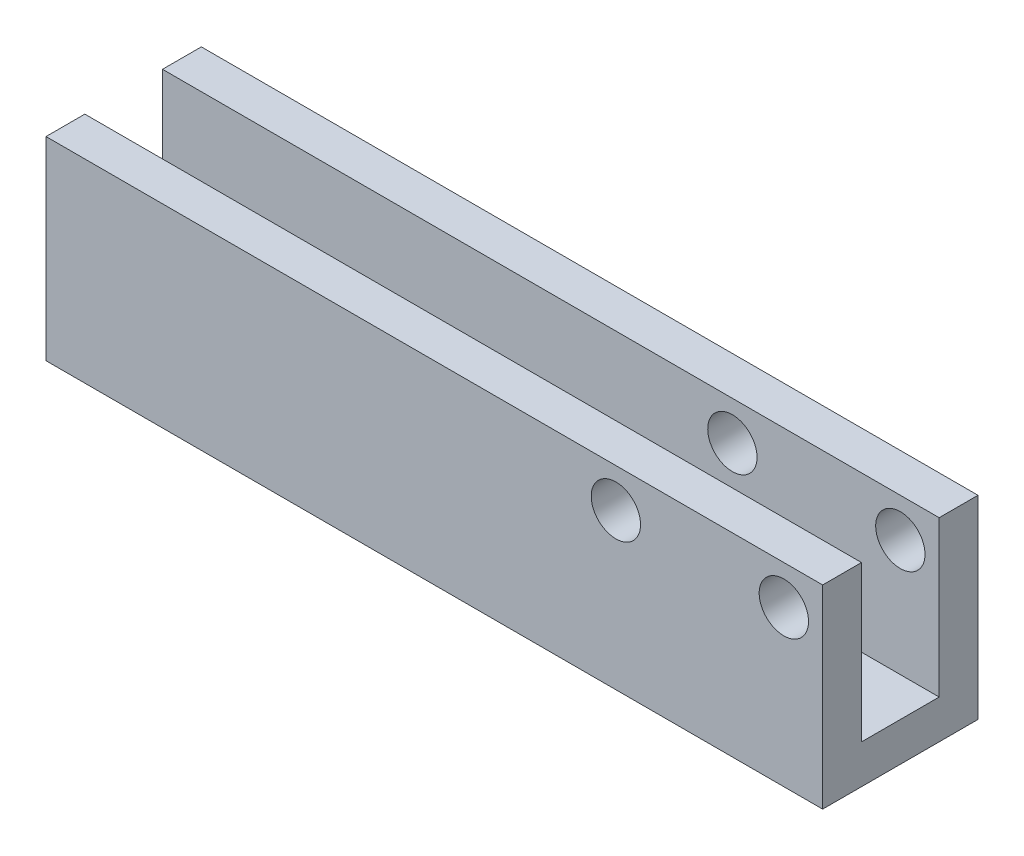
ISO-10303-21;
HEADER;
FILE_DESCRIPTION(('STEP AP214'),'2;1');
FILE_NAME('part.step','',(''),(''),'','','');
FILE_SCHEMA(('AUTOMOTIVE_DESIGN { 1 0 10303 214 1 1 1 1 }'));
ENDSEC;
DATA;
#1=APPLICATION_CONTEXT('core data for automotive mechanical design processes');
#2=APPLICATION_PROTOCOL_DEFINITION('international standard','automotive_design',2000,#1);
#3=PRODUCT_CONTEXT('',#1,'mechanical');
#4=PRODUCT('Part','Part','',(#3));
#5=PRODUCT_RELATED_PRODUCT_CATEGORY('part','',(#4));
#6=PRODUCT_DEFINITION_FORMATION('','',#4);
#7=PRODUCT_DEFINITION_CONTEXT('part definition',#1,'design');
#8=PRODUCT_DEFINITION('design','',#6,#7);
#9=PRODUCT_DEFINITION_SHAPE('','',#8);
#10=(LENGTH_UNIT() NAMED_UNIT(*) SI_UNIT(.MILLI.,.METRE.));
#11=(NAMED_UNIT(*) PLANE_ANGLE_UNIT() SI_UNIT($,.RADIAN.));
#12=(NAMED_UNIT(*) SI_UNIT($,.STERADIAN.) SOLID_ANGLE_UNIT());
#13=UNCERTAINTY_MEASURE_WITH_UNIT(LENGTH_MEASURE(1.E-05),#10,'distance_accuracy_value','');
#14=(GEOMETRIC_REPRESENTATION_CONTEXT(3) GLOBAL_UNCERTAINTY_ASSIGNED_CONTEXT((#13)) GLOBAL_UNIT_ASSIGNED_CONTEXT((#10,
#11,#12)) REPRESENTATION_CONTEXT('',''));
#15=CARTESIAN_POINT('',(0.,0.,0.));
#16=DIRECTION('',(0.,0.,1.));
#17=DIRECTION('',(1.,0.,0.));
#18=AXIS2_PLACEMENT_3D('',#15,#16,#17);
#19=CARTESIAN_POINT('',(-100.,25.,40.));
#20=DIRECTION('',(0.,-1.,0.));
#21=DIRECTION('',(0.,0.,-1.));
#22=AXIS2_PLACEMENT_3D('',#19,#20,#21);
#23=PLANE('',#22);
#24=DIRECTION('',(0.,0.,-1.));
#25=VECTOR('',#24,1.);
#26=CARTESIAN_POINT('',(-100.,25.,40.));
#27=LINE('',#26,#25);
#28=CARTESIAN_POINT('',(-100.,25.,10.));
#29=VERTEX_POINT('',#28);
#30=CARTESIAN_POINT('',(-100.,25.,0.));
#31=VERTEX_POINT('',#30);
#32=EDGE_CURVE('E180',#29,#31,#27,.T.);
#33=ORIENTED_EDGE('',*,*,#32,.F.);
#34=DIRECTION('',(-1.,0.,0.));
#35=VECTOR('',#34,1.);
#36=CARTESIAN_POINT('',(100.,25.,10.));
#37=LINE('',#36,#35);
#38=CARTESIAN_POINT('',(100.,25.,10.));
#39=VERTEX_POINT('',#38);
#40=EDGE_CURVE('E137',#39,#29,#37,.T.);
#41=ORIENTED_EDGE('',*,*,#40,.F.);
#42=DIRECTION('',(0.,0.,-1.));
#43=VECTOR('',#42,1.);
#44=CARTESIAN_POINT('',(100.,25.,40.));
#45=LINE('',#44,#43);
#46=CARTESIAN_POINT('',(100.,25.,0.));
#47=VERTEX_POINT('',#46);
#48=EDGE_CURVE('E43',#39,#47,#45,.T.);
#49=ORIENTED_EDGE('',*,*,#48,.T.);
#50=DIRECTION('',(-1.,0.,0.));
#51=VECTOR('',#50,1.);
#52=CARTESIAN_POINT('',(-100.,25.,0.));
#53=LINE('',#52,#51);
#54=EDGE_CURVE('E171',#47,#31,#53,.T.);
#55=ORIENTED_EDGE('',*,*,#54,.T.);
#56=EDGE_LOOP('',(#33,#41,#49,#55));
#57=FACE_BOUND('',#56,.T.);
#58=ADVANCED_FACE('F34',(#57),#23,.F.);
#59=CARTESIAN_POINT('',(46.75,15.,0.));
#60=DIRECTION('',(0.,0.,1.));
#61=DIRECTION('',(1.,0.,0.));
#62=AXIS2_PLACEMENT_3D('',#59,#60,#61);
#63=CYLINDRICAL_SURFACE('',#62,6.35);
#64=CARTESIAN_POINT('',(46.75,15.,10.));
#65=DIRECTION('',(0.,0.,-1.));
#66=DIRECTION('',(0.,1.,0.));
#67=AXIS2_PLACEMENT_3D('',#64,#65,#66);
#68=CIRCLE('',#67,6.35);
#69=CARTESIAN_POINT('',(46.75,21.35,10.));
#70=VERTEX_POINT('',#69);
#71=EDGE_CURVE('E147',#70,#70,#68,.F.);
#72=ORIENTED_EDGE('',*,*,#71,.T.);
#73=EDGE_LOOP('',(#72));
#74=FACE_BOUND('',#73,.T.);
#75=CARTESIAN_POINT('',(46.75,15.,0.));
#76=DIRECTION('',(0.,0.,1.));
#77=DIRECTION('',(1.,0.,0.));
#78=AXIS2_PLACEMENT_3D('',#75,#76,#77);
#79=CIRCLE('',#78,6.35);
#80=CARTESIAN_POINT('',(53.1,15.,0.));
#81=VERTEX_POINT('',#80);
#82=EDGE_CURVE('E158',#81,#81,#79,.T.);
#83=ORIENTED_EDGE('',*,*,#82,.F.);
#84=EDGE_LOOP('',(#83));
#85=FACE_BOUND('',#84,.T.);
#86=ADVANCED_FACE('F202',(#74,#85),#63,.F.);
#87=CARTESIAN_POINT('',(90.,15.,0.));
#88=DIRECTION('',(0.,0.,1.));
#89=DIRECTION('',(1.,0.,0.));
#90=AXIS2_PLACEMENT_3D('',#87,#88,#89);
#91=CYLINDRICAL_SURFACE('',#90,6.35);
#92=CARTESIAN_POINT('',(90.,15.,10.));
#93=DIRECTION('',(0.,0.,-1.));
#94=DIRECTION('',(0.,1.,0.));
#95=AXIS2_PLACEMENT_3D('',#92,#93,#94);
#96=CIRCLE('',#95,6.35);
#97=CARTESIAN_POINT('',(90.,21.35,10.));
#98=VERTEX_POINT('',#97);
#99=EDGE_CURVE('E38',#98,#98,#96,.F.);
#100=ORIENTED_EDGE('',*,*,#99,.T.);
#101=EDGE_LOOP('',(#100));
#102=FACE_BOUND('',#101,.T.);
#103=CARTESIAN_POINT('',(90.,15.,0.));
#104=DIRECTION('',(0.,0.,1.));
#105=DIRECTION('',(1.,0.,0.));
#106=AXIS2_PLACEMENT_3D('',#103,#104,#105);
#107=CIRCLE('',#106,6.35);
#108=CARTESIAN_POINT('',(96.35,15.,0.));
#109=VERTEX_POINT('',#108);
#110=EDGE_CURVE('E151',#109,#109,#107,.T.);
#111=ORIENTED_EDGE('',*,*,#110,.F.);
#112=EDGE_LOOP('',(#111));
#113=FACE_BOUND('',#112,.T.);
#114=ADVANCED_FACE('F227',(#102,#113),#91,.F.);
#115=CARTESIAN_POINT('',(100.,-25.,40.));
#116=DIRECTION('',(-1.,0.,0.));
#117=DIRECTION('',(0.,0.,1.));
#118=AXIS2_PLACEMENT_3D('',#115,#116,#117);
#119=PLANE('',#118);
#120=ORIENTED_EDGE('',*,*,#48,.F.);
#121=DIRECTION('',(0.,-1.,0.));
#122=VECTOR('',#121,1.);
#123=CARTESIAN_POINT('',(100.,25.,10.));
#124=LINE('',#123,#122);
#125=CARTESIAN_POINT('',(100.,-15.,10.));
#126=VERTEX_POINT('',#125);
#127=EDGE_CURVE('E112',#39,#126,#124,.T.);
#128=ORIENTED_EDGE('',*,*,#127,.T.);
#129=DIRECTION('',(0.,0.,1.));
#130=VECTOR('',#129,1.);
#131=CARTESIAN_POINT('',(100.,-15.,10.));
#132=LINE('',#131,#130);
#133=CARTESIAN_POINT('',(100.,-15.,30.));
#134=VERTEX_POINT('',#133);
#135=EDGE_CURVE('E121',#126,#134,#132,.T.);
#136=ORIENTED_EDGE('',*,*,#135,.T.);
#137=DIRECTION('',(0.,1.,0.));
#138=VECTOR('',#137,1.);
#139=CARTESIAN_POINT('',(100.,25.,30.));
#140=LINE('',#139,#138);
#141=CARTESIAN_POINT('',(100.,25.,30.));
#142=VERTEX_POINT('',#141);
#143=EDGE_CURVE('E118',#134,#142,#140,.T.);
#144=ORIENTED_EDGE('',*,*,#143,.T.);
#145=CARTESIAN_POINT('',(100.,25.,40.));
#146=VERTEX_POINT('',#145);
#147=EDGE_CURVE('E11',#146,#142,#45,.T.);
#148=ORIENTED_EDGE('',*,*,#147,.F.);
#149=DIRECTION('',(0.,1.,0.));
#150=VECTOR('',#149,1.);
#151=CARTESIAN_POINT('',(100.,-25.,40.));
#152=LINE('',#151,#150);
#153=CARTESIAN_POINT('',(100.,-25.,40.));
#154=VERTEX_POINT('',#153);
#155=EDGE_CURVE('E163',#154,#146,#152,.T.);
#156=ORIENTED_EDGE('',*,*,#155,.F.);
#157=DIRECTION('',(0.,0.,-1.));
#158=VECTOR('',#157,1.);
#159=CARTESIAN_POINT('',(100.,-25.,40.));
#160=LINE('',#159,#158);
#161=CARTESIAN_POINT('',(100.,-25.,0.));
#162=VERTEX_POINT('',#161);
#163=EDGE_CURVE('E169',#154,#162,#160,.T.);
#164=ORIENTED_EDGE('',*,*,#163,.T.);
#165=DIRECTION('',(0.,1.,0.));
#166=VECTOR('',#165,1.);
#167=CARTESIAN_POINT('',(100.,-25.,0.));
#168=LINE('',#167,#166);
#169=EDGE_CURVE('E154',#162,#47,#168,.T.);
#170=ORIENTED_EDGE('',*,*,#169,.T.);
#171=EDGE_LOOP('',(#120,#128,#136,#144,#148,#156,#164,#170));
#172=FACE_BOUND('',#171,.T.);
#173=ADVANCED_FACE('F36',(#172),#119,.F.);
#174=ORIENTED_EDGE('',*,*,#147,.T.);
#175=DIRECTION('',(-1.,0.,0.));
#176=VECTOR('',#175,1.);
#177=CARTESIAN_POINT('',(100.,25.,30.));
#178=LINE('',#177,#176);
#179=CARTESIAN_POINT('',(-100.,25.,30.));
#180=VERTEX_POINT('',#179);
#181=EDGE_CURVE('E140',#142,#180,#178,.T.);
#182=ORIENTED_EDGE('',*,*,#181,.T.);
#183=CARTESIAN_POINT('',(-100.,25.,40.));
#184=VERTEX_POINT('',#183);
#185=EDGE_CURVE('E181',#184,#180,#27,.T.);
#186=ORIENTED_EDGE('',*,*,#185,.F.);
#187=DIRECTION('',(-1.,0.,0.));
#188=VECTOR('',#187,1.);
#189=CARTESIAN_POINT('',(-100.,25.,40.));
#190=LINE('',#189,#188);
#191=EDGE_CURVE('E88',#146,#184,#190,.T.);
#192=ORIENTED_EDGE('',*,*,#191,.F.);
#193=EDGE_LOOP('',(#174,#182,#186,#192));
#194=FACE_BOUND('',#193,.T.);
#195=ADVANCED_FACE('F212',(#194),#23,.F.);
#196=CARTESIAN_POINT('',(-100.,-25.,40.));
#197=DIRECTION('',(1.,0.,0.));
#198=DIRECTION('',(0.,0.,-1.));
#199=AXIS2_PLACEMENT_3D('',#196,#197,#198);
#200=PLANE('',#199);
#201=DIRECTION('',(0.,0.,1.));
#202=VECTOR('',#201,1.);
#203=CARTESIAN_POINT('',(-100.,-15.,10.));
#204=LINE('',#203,#202);
#205=CARTESIAN_POINT('',(-100.,-15.,10.));
#206=VERTEX_POINT('',#205);
#207=CARTESIAN_POINT('',(-100.,-15.,30.));
#208=VERTEX_POINT('',#207);
#209=EDGE_CURVE('E131',#206,#208,#204,.T.);
#210=ORIENTED_EDGE('',*,*,#209,.F.);
#211=DIRECTION('',(0.,-1.,0.));
#212=VECTOR('',#211,1.);
#213=CARTESIAN_POINT('',(-100.,25.,10.));
#214=LINE('',#213,#212);
#215=EDGE_CURVE('E51',#29,#206,#214,.T.);
#216=ORIENTED_EDGE('',*,*,#215,.F.);
#217=ORIENTED_EDGE('',*,*,#32,.T.);
#218=DIRECTION('',(0.,-1.,0.));
#219=VECTOR('',#218,1.);
#220=CARTESIAN_POINT('',(-100.,-25.,0.));
#221=LINE('',#220,#219);
#222=CARTESIAN_POINT('',(-100.,-25.,0.));
#223=VERTEX_POINT('',#222);
#224=EDGE_CURVE('E174',#31,#223,#221,.T.);
#225=ORIENTED_EDGE('',*,*,#224,.T.);
#226=DIRECTION('',(0.,0.,-1.));
#227=VECTOR('',#226,1.);
#228=CARTESIAN_POINT('',(-100.,-25.,40.));
#229=LINE('',#228,#227);
#230=CARTESIAN_POINT('',(-100.,-25.,40.));
#231=VERTEX_POINT('',#230);
#232=EDGE_CURVE('E178',#231,#223,#229,.T.);
#233=ORIENTED_EDGE('',*,*,#232,.F.);
#234=DIRECTION('',(0.,-1.,0.));
#235=VECTOR('',#234,1.);
#236=CARTESIAN_POINT('',(-100.,-25.,40.));
#237=LINE('',#236,#235);
#238=EDGE_CURVE('E166',#184,#231,#237,.T.);
#239=ORIENTED_EDGE('',*,*,#238,.F.);
#240=ORIENTED_EDGE('',*,*,#185,.T.);
#241=DIRECTION('',(0.,1.,0.));
#242=VECTOR('',#241,1.);
#243=CARTESIAN_POINT('',(-100.,25.,30.));
#244=LINE('',#243,#242);
#245=EDGE_CURVE('E129',#208,#180,#244,.T.);
#246=ORIENTED_EDGE('',*,*,#245,.F.);
#247=EDGE_LOOP('',(#210,#216,#217,#225,#233,#239,#240,#246));
#248=FACE_BOUND('',#247,.T.);
#249=ADVANCED_FACE('F215',(#248),#200,.F.);
#250=CARTESIAN_POINT('',(-100.,-25.,40.));
#251=DIRECTION('',(0.,1.,0.));
#252=DIRECTION('',(0.,0.,1.));
#253=AXIS2_PLACEMENT_3D('',#250,#251,#252);
#254=PLANE('',#253);
#255=DIRECTION('',(1.,0.,0.));
#256=VECTOR('',#255,1.);
#257=CARTESIAN_POINT('',(-100.,-25.,0.));
#258=LINE('',#257,#256);
#259=EDGE_CURVE('E81',#223,#162,#258,.T.);
#260=ORIENTED_EDGE('',*,*,#259,.T.);
#261=ORIENTED_EDGE('',*,*,#163,.F.);
#262=DIRECTION('',(1.,0.,0.));
#263=VECTOR('',#262,1.);
#264=CARTESIAN_POINT('',(-100.,-25.,40.));
#265=LINE('',#264,#263);
#266=EDGE_CURVE('E60',#231,#154,#265,.T.);
#267=ORIENTED_EDGE('',*,*,#266,.F.);
#268=ORIENTED_EDGE('',*,*,#232,.T.);
#269=EDGE_LOOP('',(#260,#261,#267,#268));
#270=FACE_BOUND('',#269,.T.);
#271=ADVANCED_FACE('F207',(#270),#254,.F.);
#272=CARTESIAN_POINT('',(0.,0.,40.));
#273=DIRECTION('',(0.,0.,-1.));
#274=DIRECTION('',(-1.,0.,0.));
#275=AXIS2_PLACEMENT_3D('',#272,#273,#274);
#276=PLANE('',#275);
#277=CARTESIAN_POINT('',(90.,15.,40.));
#278=DIRECTION('',(0.,0.,1.));
#279=DIRECTION('',(1.,0.,0.));
#280=AXIS2_PLACEMENT_3D('',#277,#278,#279);
#281=CIRCLE('',#280,6.35);
#282=CARTESIAN_POINT('',(96.35,15.,40.));
#283=VERTEX_POINT('',#282);
#284=EDGE_CURVE('E155',#283,#283,#281,.T.);
#285=ORIENTED_EDGE('',*,*,#284,.F.);
#286=EDGE_LOOP('',(#285));
#287=FACE_BOUND('',#286,.T.);
#288=CARTESIAN_POINT('',(46.75,15.,40.));
#289=DIRECTION('',(0.,0.,1.));
#290=DIRECTION('',(1.,0.,0.));
#291=AXIS2_PLACEMENT_3D('',#288,#289,#290);
#292=CIRCLE('',#291,6.35);
#293=CARTESIAN_POINT('',(53.1,15.,40.));
#294=VERTEX_POINT('',#293);
#295=EDGE_CURVE('E150',#294,#294,#292,.T.);
#296=ORIENTED_EDGE('',*,*,#295,.F.);
#297=EDGE_LOOP('',(#296));
#298=FACE_BOUND('',#297,.T.);
#299=ORIENTED_EDGE('',*,*,#155,.T.);
#300=ORIENTED_EDGE('',*,*,#191,.T.);
#301=ORIENTED_EDGE('',*,*,#238,.T.);
#302=ORIENTED_EDGE('',*,*,#266,.T.);
#303=EDGE_LOOP('',(#299,#300,#301,#302));
#304=FACE_BOUND('',#303,.T.);
#305=ADVANCED_FACE('F205',(#287,#298,#304),#276,.F.);
#306=CARTESIAN_POINT('',(0.,0.,0.));
#307=DIRECTION('',(0.,0.,-1.));
#308=DIRECTION('',(-1.,0.,0.));
#309=AXIS2_PLACEMENT_3D('',#306,#307,#308);
#310=PLANE('',#309);
#311=ORIENTED_EDGE('',*,*,#110,.T.);
#312=EDGE_LOOP('',(#311));
#313=FACE_BOUND('',#312,.T.);
#314=ORIENTED_EDGE('',*,*,#82,.T.);
#315=EDGE_LOOP('',(#314));
#316=FACE_BOUND('',#315,.T.);
#317=ORIENTED_EDGE('',*,*,#169,.F.);
#318=ORIENTED_EDGE('',*,*,#259,.F.);
#319=ORIENTED_EDGE('',*,*,#224,.F.);
#320=ORIENTED_EDGE('',*,*,#54,.F.);
#321=EDGE_LOOP('',(#317,#318,#319,#320));
#322=FACE_BOUND('',#321,.T.);
#323=ADVANCED_FACE('F200',(#313,#316,#322),#310,.T.);
#324=CARTESIAN_POINT('',(46.75,15.,30.));
#325=DIRECTION('',(0.,0.,1.));
#326=DIRECTION('',(0.,-1.,0.));
#327=AXIS2_PLACEMENT_3D('',#324,#325,#326);
#328=CIRCLE('',#327,6.35);
#329=CARTESIAN_POINT('',(46.75,8.65000000000001,30.));
#330=VERTEX_POINT('',#329);
#331=EDGE_CURVE('E144',#330,#330,#328,.F.);
#332=ORIENTED_EDGE('',*,*,#331,.T.);
#333=EDGE_LOOP('',(#332));
#334=FACE_BOUND('',#333,.T.);
#335=ORIENTED_EDGE('',*,*,#295,.T.);
#336=EDGE_LOOP('',(#335));
#337=FACE_BOUND('',#336,.T.);
#338=ADVANCED_FACE('F197',(#334,#337),#63,.F.);
#339=CARTESIAN_POINT('',(90.,15.,30.));
#340=DIRECTION('',(0.,0.,1.));
#341=DIRECTION('',(0.,-1.,0.));
#342=AXIS2_PLACEMENT_3D('',#339,#340,#341);
#343=CIRCLE('',#342,6.35);
#344=CARTESIAN_POINT('',(90.,8.65000000000001,30.));
#345=VERTEX_POINT('',#344);
#346=EDGE_CURVE('E139',#345,#345,#343,.F.);
#347=ORIENTED_EDGE('',*,*,#346,.T.);
#348=EDGE_LOOP('',(#347));
#349=FACE_BOUND('',#348,.T.);
#350=ORIENTED_EDGE('',*,*,#284,.T.);
#351=EDGE_LOOP('',(#350));
#352=FACE_BOUND('',#351,.T.);
#353=ADVANCED_FACE('F186',(#349,#352),#91,.F.);
#354=CARTESIAN_POINT('',(100.,25.,10.));
#355=DIRECTION('',(0.,0.,-1.));
#356=DIRECTION('',(0.,1.,0.));
#357=AXIS2_PLACEMENT_3D('',#354,#355,#356);
#358=PLANE('',#357);
#359=ORIENTED_EDGE('',*,*,#99,.F.);
#360=EDGE_LOOP('',(#359));
#361=FACE_BOUND('',#360,.T.);
#362=ORIENTED_EDGE('',*,*,#215,.T.);
#363=DIRECTION('',(-1.,0.,0.));
#364=VECTOR('',#363,1.);
#365=CARTESIAN_POINT('',(100.,-15.,10.));
#366=LINE('',#365,#364);
#367=EDGE_CURVE('E107',#126,#206,#366,.T.);
#368=ORIENTED_EDGE('',*,*,#367,.F.);
#369=ORIENTED_EDGE('',*,*,#127,.F.);
#370=ORIENTED_EDGE('',*,*,#40,.T.);
#371=EDGE_LOOP('',(#362,#368,#369,#370));
#372=FACE_BOUND('',#371,.T.);
#373=ORIENTED_EDGE('',*,*,#71,.F.);
#374=EDGE_LOOP('',(#373));
#375=FACE_BOUND('',#374,.T.);
#376=ADVANCED_FACE('F109',(#361,#372,#375),#358,.F.);
#377=CARTESIAN_POINT('',(100.,25.,30.));
#378=DIRECTION('',(0.,0.,1.));
#379=DIRECTION('',(0.,-1.,0.));
#380=AXIS2_PLACEMENT_3D('',#377,#378,#379);
#381=PLANE('',#380);
#382=ORIENTED_EDGE('',*,*,#346,.F.);
#383=EDGE_LOOP('',(#382));
#384=FACE_BOUND('',#383,.T.);
#385=ORIENTED_EDGE('',*,*,#245,.T.);
#386=ORIENTED_EDGE('',*,*,#181,.F.);
#387=ORIENTED_EDGE('',*,*,#143,.F.);
#388=DIRECTION('',(-1.,0.,0.));
#389=VECTOR('',#388,1.);
#390=CARTESIAN_POINT('',(100.,-15.,30.));
#391=LINE('',#390,#389);
#392=EDGE_CURVE('E117',#134,#208,#391,.T.);
#393=ORIENTED_EDGE('',*,*,#392,.T.);
#394=EDGE_LOOP('',(#385,#386,#387,#393));
#395=FACE_BOUND('',#394,.T.);
#396=ORIENTED_EDGE('',*,*,#331,.F.);
#397=EDGE_LOOP('',(#396));
#398=FACE_BOUND('',#397,.T.);
#399=ADVANCED_FACE('F189',(#384,#395,#398),#381,.F.);
#400=CARTESIAN_POINT('',(100.,-15.,10.));
#401=DIRECTION('',(0.,-1.,0.));
#402=DIRECTION('',(0.,0.,-1.));
#403=AXIS2_PLACEMENT_3D('',#400,#401,#402);
#404=PLANE('',#403);
#405=ORIENTED_EDGE('',*,*,#209,.T.);
#406=ORIENTED_EDGE('',*,*,#392,.F.);
#407=ORIENTED_EDGE('',*,*,#135,.F.);
#408=ORIENTED_EDGE('',*,*,#367,.T.);
#409=EDGE_LOOP('',(#405,#406,#407,#408));
#410=FACE_BOUND('',#409,.T.);
#411=ADVANCED_FACE('F122',(#410),#404,.F.);
#412=CLOSED_SHELL('',(#58,#86,#114,#173,#195,#249,#271,#305,#323,#338,#353,#376,#399,#411));
#413=MANIFOLD_SOLID_BREP('B2',#412);
#414=ADVANCED_BREP_SHAPE_REPRESENTATION('',(#18,#413),#14);
#415=SHAPE_DEFINITION_REPRESENTATION(#9,#414);
ENDSEC;
END-ISO-10303-21;
